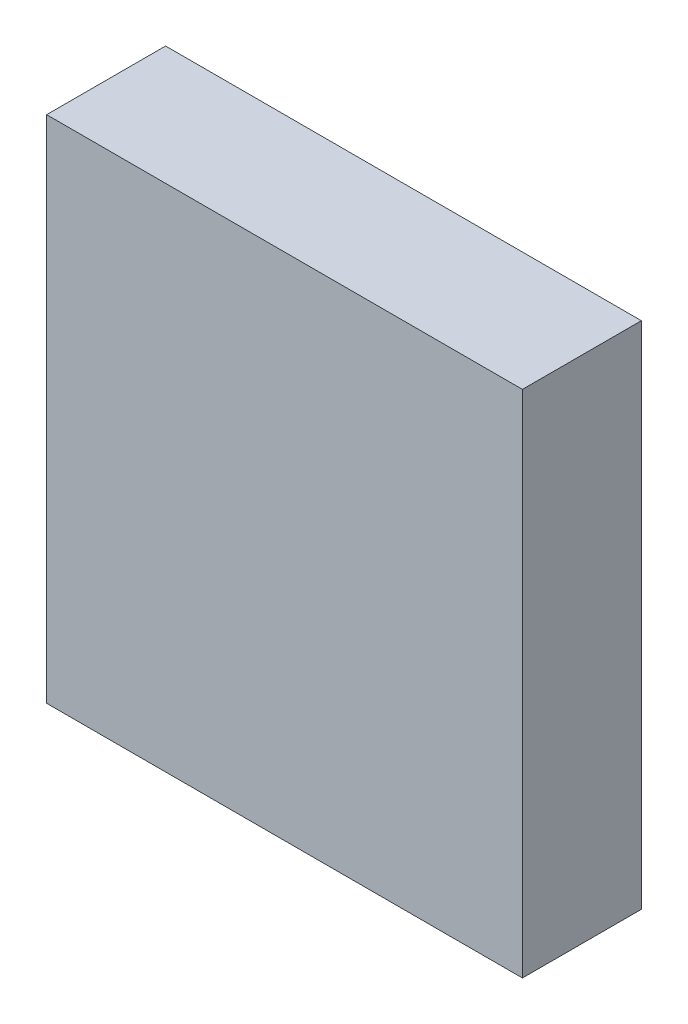
ISO-10303-21;
HEADER;
FILE_DESCRIPTION(('STEP AP214'),'2;1');
FILE_NAME('part.step','',(''),(''),'','','');
FILE_SCHEMA(('AUTOMOTIVE_DESIGN { 1 0 10303 214 1 1 1 1 }'));
ENDSEC;
DATA;
#1=APPLICATION_CONTEXT('core data for automotive mechanical design processes');
#2=APPLICATION_PROTOCOL_DEFINITION('international standard','automotive_design',2000,#1);
#3=PRODUCT_CONTEXT('',#1,'mechanical');
#4=PRODUCT('Part','Part','',(#3));
#5=PRODUCT_RELATED_PRODUCT_CATEGORY('part','',(#4));
#6=PRODUCT_DEFINITION_FORMATION('','',#4);
#7=PRODUCT_DEFINITION_CONTEXT('part definition',#1,'design');
#8=PRODUCT_DEFINITION('design','',#6,#7);
#9=PRODUCT_DEFINITION_SHAPE('','',#8);
#10=(LENGTH_UNIT() NAMED_UNIT(*) SI_UNIT(.MILLI.,.METRE.));
#11=(NAMED_UNIT(*) PLANE_ANGLE_UNIT() SI_UNIT($,.RADIAN.));
#12=(NAMED_UNIT(*) SI_UNIT($,.STERADIAN.) SOLID_ANGLE_UNIT());
#13=UNCERTAINTY_MEASURE_WITH_UNIT(LENGTH_MEASURE(1.E-05),#10,'distance_accuracy_value','');
#14=(GEOMETRIC_REPRESENTATION_CONTEXT(3) GLOBAL_UNCERTAINTY_ASSIGNED_CONTEXT((#13)) GLOBAL_UNIT_ASSIGNED_CONTEXT((#10,
#11,#12)) REPRESENTATION_CONTEXT('',''));
#15=CARTESIAN_POINT('',(0.,0.,0.));
#16=DIRECTION('',(0.,0.,1.));
#17=DIRECTION('',(1.,0.,0.));
#18=AXIS2_PLACEMENT_3D('',#15,#16,#17);
#19=CARTESIAN_POINT('',(-70.,-75.,35.));
#20=DIRECTION('',(0.,1.,0.));
#21=DIRECTION('',(0.,0.,1.));
#22=AXIS2_PLACEMENT_3D('',#19,#20,#21);
#23=PLANE('',#22);
#24=DIRECTION('',(1.,0.,0.));
#25=VECTOR('',#24,1.);
#26=CARTESIAN_POINT('',(-70.,-75.,0.));
#27=LINE('',#26,#25);
#28=CARTESIAN_POINT('',(-70.,-75.,0.));
#29=VERTEX_POINT('',#28);
#30=CARTESIAN_POINT('',(70.,-75.,0.));
#31=VERTEX_POINT('',#30);
#32=EDGE_CURVE('E138',#29,#31,#27,.T.);
#33=ORIENTED_EDGE('',*,*,#32,.T.);
#34=DIRECTION('',(0.,0.,-1.));
#35=VECTOR('',#34,1.);
#36=CARTESIAN_POINT('',(70.,-75.,35.));
#37=LINE('',#36,#35);
#38=CARTESIAN_POINT('',(70.,-75.,35.));
#39=VERTEX_POINT('',#38);
#40=EDGE_CURVE('E47',#39,#31,#37,.T.);
#41=ORIENTED_EDGE('',*,*,#40,.F.);
#42=DIRECTION('',(1.,0.,0.));
#43=VECTOR('',#42,1.);
#44=CARTESIAN_POINT('',(-70.,-75.,35.));
#45=LINE('',#44,#43);
#46=CARTESIAN_POINT('',(-70.,-75.,35.));
#47=VERTEX_POINT('',#46);
#48=EDGE_CURVE('E91',#47,#39,#45,.T.);
#49=ORIENTED_EDGE('',*,*,#48,.F.);
#50=DIRECTION('',(0.,0.,-1.));
#51=VECTOR('',#50,1.);
#52=CARTESIAN_POINT('',(-70.,-75.,35.));
#53=LINE('',#52,#51);
#54=EDGE_CURVE('E11',#47,#29,#53,.T.);
#55=ORIENTED_EDGE('',*,*,#54,.T.);
#56=EDGE_LOOP('',(#33,#41,#49,#55));
#57=FACE_BOUND('',#56,.T.);
#58=DIRECTION('',(-1.,0.,0.));
#59=VECTOR('',#58,1.);
#60=CARTESIAN_POINT('',(-45.,-75.,20.));
#61=LINE('',#60,#59);
#62=CARTESIAN_POINT('',(45.,-75.,20.));
#63=VERTEX_POINT('',#62);
#64=CARTESIAN_POINT('',(-45.,-75.,20.));
#65=VERTEX_POINT('',#64);
#66=EDGE_CURVE('E129',#63,#65,#61,.T.);
#67=ORIENTED_EDGE('',*,*,#66,.F.);
#68=DIRECTION('',(0.,0.,-1.));
#69=VECTOR('',#68,1.);
#70=CARTESIAN_POINT('',(45.,-75.,20.));
#71=LINE('',#70,#69);
#72=CARTESIAN_POINT('',(45.,-75.,4.));
#73=VERTEX_POINT('',#72);
#74=EDGE_CURVE('E140',#63,#73,#71,.T.);
#75=ORIENTED_EDGE('',*,*,#74,.T.);
#76=DIRECTION('',(-1.,0.,0.));
#77=VECTOR('',#76,1.);
#78=CARTESIAN_POINT('',(-45.,-75.,4.));
#79=LINE('',#78,#77);
#80=CARTESIAN_POINT('',(-45.,-75.,4.));
#81=VERTEX_POINT('',#80);
#82=EDGE_CURVE('E132',#73,#81,#79,.T.);
#83=ORIENTED_EDGE('',*,*,#82,.T.);
#84=DIRECTION('',(0.,0.,-1.));
#85=VECTOR('',#84,1.);
#86=CARTESIAN_POINT('',(-45.,-75.,20.));
#87=LINE('',#86,#85);
#88=EDGE_CURVE('E190',#65,#81,#87,.T.);
#89=ORIENTED_EDGE('',*,*,#88,.F.);
#90=EDGE_LOOP('',(#67,#75,#83,#89));
#91=FACE_BOUND('',#90,.T.);
#92=ADVANCED_FACE('F39',(#57,#91),#23,.F.);
#93=CARTESIAN_POINT('',(-70.,-75.,35.));
#94=DIRECTION('',(1.,0.,0.));
#95=DIRECTION('',(0.,0.,-1.));
#96=AXIS2_PLACEMENT_3D('',#93,#94,#95);
#97=PLANE('',#96);
#98=DIRECTION('',(0.,-1.,0.));
#99=VECTOR('',#98,1.);
#100=CARTESIAN_POINT('',(-70.,-75.,0.));
#101=LINE('',#100,#99);
#102=CARTESIAN_POINT('',(-70.,75.,0.));
#103=VERTEX_POINT('',#102);
#104=EDGE_CURVE('E135',#103,#29,#101,.T.);
#105=ORIENTED_EDGE('',*,*,#104,.T.);
#106=ORIENTED_EDGE('',*,*,#54,.F.);
#107=DIRECTION('',(0.,-1.,0.));
#108=VECTOR('',#107,1.);
#109=CARTESIAN_POINT('',(-70.,-75.,35.));
#110=LINE('',#109,#108);
#111=CARTESIAN_POINT('',(-70.,75.,35.));
#112=VERTEX_POINT('',#111);
#113=EDGE_CURVE('E144',#112,#47,#110,.T.);
#114=ORIENTED_EDGE('',*,*,#113,.F.);
#115=DIRECTION('',(0.,0.,-1.));
#116=VECTOR('',#115,1.);
#117=CARTESIAN_POINT('',(-70.,75.,35.));
#118=LINE('',#117,#116);
#119=EDGE_CURVE('E149',#112,#103,#118,.T.);
#120=ORIENTED_EDGE('',*,*,#119,.T.);
#121=EDGE_LOOP('',(#105,#106,#114,#120));
#122=FACE_BOUND('',#121,.T.);
#123=ADVANCED_FACE('F41',(#122),#97,.F.);
#124=CARTESIAN_POINT('',(70.,-75.,35.));
#125=DIRECTION('',(-1.,0.,0.));
#126=DIRECTION('',(0.,0.,1.));
#127=AXIS2_PLACEMENT_3D('',#124,#125,#126);
#128=PLANE('',#127);
#129=DIRECTION('',(0.,1.,0.));
#130=VECTOR('',#129,1.);
#131=CARTESIAN_POINT('',(70.,-75.,0.));
#132=LINE('',#131,#130);
#133=CARTESIAN_POINT('',(70.,75.,0.));
#134=VERTEX_POINT('',#133);
#135=EDGE_CURVE('E152',#31,#134,#132,.T.);
#136=ORIENTED_EDGE('',*,*,#135,.T.);
#137=DIRECTION('',(0.,0.,-1.));
#138=VECTOR('',#137,1.);
#139=CARTESIAN_POINT('',(70.,75.,35.));
#140=LINE('',#139,#138);
#141=CARTESIAN_POINT('',(70.,75.,35.));
#142=VERTEX_POINT('',#141);
#143=EDGE_CURVE('E156',#142,#134,#140,.T.);
#144=ORIENTED_EDGE('',*,*,#143,.F.);
#145=DIRECTION('',(0.,1.,0.));
#146=VECTOR('',#145,1.);
#147=CARTESIAN_POINT('',(70.,-75.,35.));
#148=LINE('',#147,#146);
#149=EDGE_CURVE('E147',#39,#142,#148,.T.);
#150=ORIENTED_EDGE('',*,*,#149,.F.);
#151=ORIENTED_EDGE('',*,*,#40,.T.);
#152=EDGE_LOOP('',(#136,#144,#150,#151));
#153=FACE_BOUND('',#152,.T.);
#154=ADVANCED_FACE('F161',(#153),#128,.F.);
#155=CARTESIAN_POINT('',(-70.,75.,35.));
#156=DIRECTION('',(0.,-1.,0.));
#157=DIRECTION('',(0.,0.,-1.));
#158=AXIS2_PLACEMENT_3D('',#155,#156,#157);
#159=PLANE('',#158);
#160=DIRECTION('',(-1.,0.,0.));
#161=VECTOR('',#160,1.);
#162=CARTESIAN_POINT('',(-70.,75.,0.));
#163=LINE('',#162,#161);
#164=EDGE_CURVE('E84',#134,#103,#163,.T.);
#165=ORIENTED_EDGE('',*,*,#164,.T.);
#166=ORIENTED_EDGE('',*,*,#119,.F.);
#167=DIRECTION('',(-1.,0.,0.));
#168=VECTOR('',#167,1.);
#169=CARTESIAN_POINT('',(-70.,75.,35.));
#170=LINE('',#169,#168);
#171=EDGE_CURVE('E63',#142,#112,#170,.T.);
#172=ORIENTED_EDGE('',*,*,#171,.F.);
#173=ORIENTED_EDGE('',*,*,#143,.T.);
#174=EDGE_LOOP('',(#165,#166,#172,#173));
#175=FACE_BOUND('',#174,.T.);
#176=ADVANCED_FACE('F169',(#175),#159,.F.);
#177=CARTESIAN_POINT('',(0.,0.,35.));
#178=DIRECTION('',(0.,0.,-1.));
#179=DIRECTION('',(-1.,0.,0.));
#180=AXIS2_PLACEMENT_3D('',#177,#178,#179);
#181=PLANE('',#180);
#182=ORIENTED_EDGE('',*,*,#113,.T.);
#183=ORIENTED_EDGE('',*,*,#48,.T.);
#184=ORIENTED_EDGE('',*,*,#149,.T.);
#185=ORIENTED_EDGE('',*,*,#171,.T.);
#186=EDGE_LOOP('',(#182,#183,#184,#185));
#187=FACE_BOUND('',#186,.T.);
#188=ADVANCED_FACE('F171',(#187),#181,.F.);
#189=CARTESIAN_POINT('',(0.,0.,0.));
#190=DIRECTION('',(0.,0.,-1.));
#191=DIRECTION('',(-1.,0.,0.));
#192=AXIS2_PLACEMENT_3D('',#189,#190,#191);
#193=PLANE('',#192);
#194=ORIENTED_EDGE('',*,*,#104,.F.);
#195=ORIENTED_EDGE('',*,*,#164,.F.);
#196=ORIENTED_EDGE('',*,*,#135,.F.);
#197=ORIENTED_EDGE('',*,*,#32,.F.);
#198=EDGE_LOOP('',(#194,#195,#196,#197));
#199=FACE_BOUND('',#198,.T.);
#200=ADVANCED_FACE('F165',(#199),#193,.T.);
#201=CARTESIAN_POINT('',(-45.,-81.,20.));
#202=DIRECTION('',(1.,0.,0.));
#203=DIRECTION('',(0.,0.,-1.));
#204=AXIS2_PLACEMENT_3D('',#201,#202,#203);
#205=PLANE('',#204);
#206=DIRECTION('',(0.,-1.,0.));
#207=VECTOR('',#206,1.);
#208=CARTESIAN_POINT('',(-45.,-81.,4.));
#209=LINE('',#208,#207);
#210=CARTESIAN_POINT('',(-45.,-81.,4.));
#211=VERTEX_POINT('',#210);
#212=EDGE_CURVE('E54',#81,#211,#209,.T.);
#213=ORIENTED_EDGE('',*,*,#212,.T.);
#214=DIRECTION('',(0.,0.,-1.));
#215=VECTOR('',#214,1.);
#216=CARTESIAN_POINT('',(-45.,-81.,20.));
#217=LINE('',#216,#215);
#218=CARTESIAN_POINT('',(-45.,-81.,20.));
#219=VERTEX_POINT('',#218);
#220=EDGE_CURVE('E118',#219,#211,#217,.T.);
#221=ORIENTED_EDGE('',*,*,#220,.F.);
#222=DIRECTION('',(0.,-1.,0.));
#223=VECTOR('',#222,1.);
#224=CARTESIAN_POINT('',(-45.,-81.,20.));
#225=LINE('',#224,#223);
#226=EDGE_CURVE('E124',#65,#219,#225,.T.);
#227=ORIENTED_EDGE('',*,*,#226,.F.);
#228=ORIENTED_EDGE('',*,*,#88,.T.);
#229=EDGE_LOOP('',(#213,#221,#227,#228));
#230=FACE_BOUND('',#229,.T.);
#231=ADVANCED_FACE('F134',(#230),#205,.F.);
#232=CARTESIAN_POINT('',(-45.,-81.,20.));
#233=DIRECTION('',(0.,1.,0.));
#234=DIRECTION('',(0.,0.,1.));
#235=AXIS2_PLACEMENT_3D('',#232,#233,#234);
#236=PLANE('',#235);
#237=DIRECTION('',(1.,0.,0.));
#238=VECTOR('',#237,1.);
#239=CARTESIAN_POINT('',(-45.,-81.,4.));
#240=LINE('',#239,#238);
#241=CARTESIAN_POINT('',(45.,-81.,4.));
#242=VERTEX_POINT('',#241);
#243=EDGE_CURVE('E196',#211,#242,#240,.T.);
#244=ORIENTED_EDGE('',*,*,#243,.T.);
#245=DIRECTION('',(0.,0.,-1.));
#246=VECTOR('',#245,1.);
#247=CARTESIAN_POINT('',(45.,-81.,20.));
#248=LINE('',#247,#246);
#249=CARTESIAN_POINT('',(45.,-81.,20.));
#250=VERTEX_POINT('',#249);
#251=EDGE_CURVE('E120',#250,#242,#248,.T.);
#252=ORIENTED_EDGE('',*,*,#251,.F.);
#253=DIRECTION('',(1.,0.,0.));
#254=VECTOR('',#253,1.);
#255=CARTESIAN_POINT('',(-45.,-81.,20.));
#256=LINE('',#255,#254);
#257=EDGE_CURVE('E114',#219,#250,#256,.T.);
#258=ORIENTED_EDGE('',*,*,#257,.F.);
#259=ORIENTED_EDGE('',*,*,#220,.T.);
#260=EDGE_LOOP('',(#244,#252,#258,#259));
#261=FACE_BOUND('',#260,.T.);
#262=ADVANCED_FACE('F116',(#261),#236,.F.);
#263=CARTESIAN_POINT('',(45.,-81.,20.));
#264=DIRECTION('',(-1.,0.,0.));
#265=DIRECTION('',(0.,0.,1.));
#266=AXIS2_PLACEMENT_3D('',#263,#264,#265);
#267=PLANE('',#266);
#268=DIRECTION('',(0.,1.,0.));
#269=VECTOR('',#268,1.);
#270=CARTESIAN_POINT('',(45.,-81.,4.));
#271=LINE('',#270,#269);
#272=EDGE_CURVE('E198',#242,#73,#271,.T.);
#273=ORIENTED_EDGE('',*,*,#272,.T.);
#274=ORIENTED_EDGE('',*,*,#74,.F.);
#275=DIRECTION('',(0.,1.,0.));
#276=VECTOR('',#275,1.);
#277=CARTESIAN_POINT('',(45.,-81.,20.));
#278=LINE('',#277,#276);
#279=EDGE_CURVE('E123',#250,#63,#278,.T.);
#280=ORIENTED_EDGE('',*,*,#279,.F.);
#281=ORIENTED_EDGE('',*,*,#251,.T.);
#282=EDGE_LOOP('',(#273,#274,#280,#281));
#283=FACE_BOUND('',#282,.T.);
#284=ADVANCED_FACE('F203',(#283),#267,.F.);
#285=CARTESIAN_POINT('',(0.,0.,20.));
#286=DIRECTION('',(0.,0.,-1.));
#287=DIRECTION('',(-1.,0.,0.));
#288=AXIS2_PLACEMENT_3D('',#285,#286,#287);
#289=PLANE('',#288);
#290=ORIENTED_EDGE('',*,*,#226,.T.);
#291=ORIENTED_EDGE('',*,*,#257,.T.);
#292=ORIENTED_EDGE('',*,*,#279,.T.);
#293=ORIENTED_EDGE('',*,*,#66,.T.);
#294=EDGE_LOOP('',(#290,#291,#292,#293));
#295=FACE_BOUND('',#294,.T.);
#296=ADVANCED_FACE('F127',(#295),#289,.F.);
#297=CARTESIAN_POINT('',(0.,0.,4.));
#298=DIRECTION('',(0.,0.,-1.));
#299=DIRECTION('',(-1.,0.,0.));
#300=AXIS2_PLACEMENT_3D('',#297,#298,#299);
#301=PLANE('',#300);
#302=ORIENTED_EDGE('',*,*,#212,.F.);
#303=ORIENTED_EDGE('',*,*,#82,.F.);
#304=ORIENTED_EDGE('',*,*,#272,.F.);
#305=ORIENTED_EDGE('',*,*,#243,.F.);
#306=EDGE_LOOP('',(#302,#303,#304,#305));
#307=FACE_BOUND('',#306,.T.);
#308=ADVANCED_FACE('F201',(#307),#301,.T.);
#309=CLOSED_SHELL('',(#92,#123,#154,#176,#188,#200,#231,#262,#284,#296,#308));
#310=MANIFOLD_SOLID_BREP('B2',#309);
#311=ADVANCED_BREP_SHAPE_REPRESENTATION('',(#18,#310),#14);
#312=SHAPE_DEFINITION_REPRESENTATION(#9,#311);
ENDSEC;
END-ISO-10303-21;
